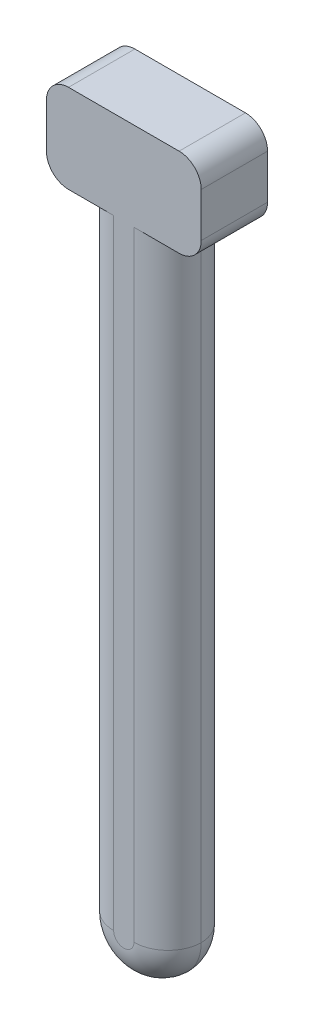
ISO-10303-21;
HEADER;
FILE_DESCRIPTION(('STEP AP214'),'2;1');
FILE_NAME('part.step','',(''),(''),'','','');
FILE_SCHEMA(('AUTOMOTIVE_DESIGN { 1 0 10303 214 1 1 1 1 }'));
ENDSEC;
DATA;
#1=APPLICATION_CONTEXT('core data for automotive mechanical design processes');
#2=APPLICATION_PROTOCOL_DEFINITION('international standard','automotive_design',2000,#1);
#3=PRODUCT_CONTEXT('',#1,'mechanical');
#4=PRODUCT('Part','Part','',(#3));
#5=PRODUCT_RELATED_PRODUCT_CATEGORY('part','',(#4));
#6=PRODUCT_DEFINITION_FORMATION('','',#4);
#7=PRODUCT_DEFINITION_CONTEXT('part definition',#1,'design');
#8=PRODUCT_DEFINITION('design','',#6,#7);
#9=PRODUCT_DEFINITION_SHAPE('','',#8);
#10=(LENGTH_UNIT() NAMED_UNIT(*) SI_UNIT(.MILLI.,.METRE.));
#11=(NAMED_UNIT(*) PLANE_ANGLE_UNIT() SI_UNIT($,.RADIAN.));
#12=(NAMED_UNIT(*) SI_UNIT($,.STERADIAN.) SOLID_ANGLE_UNIT());
#13=UNCERTAINTY_MEASURE_WITH_UNIT(LENGTH_MEASURE(1.E-05),#10,'distance_accuracy_value','');
#14=(GEOMETRIC_REPRESENTATION_CONTEXT(3) GLOBAL_UNCERTAINTY_ASSIGNED_CONTEXT((#13)) GLOBAL_UNIT_ASSIGNED_CONTEXT((#10,
#11,#12)) REPRESENTATION_CONTEXT('',''));
#15=CARTESIAN_POINT('',(0.,0.,0.));
#16=DIRECTION('',(0.,0.,1.));
#17=DIRECTION('',(1.,0.,0.));
#18=AXIS2_PLACEMENT_3D('',#15,#16,#17);
#19=CARTESIAN_POINT('',(0.,2.,3.));
#20=DIRECTION('',(0.,1.,0.));
#21=DIRECTION('',(0.,0.,1.));
#22=AXIS2_PLACEMENT_3D('',#19,#20,#21);
#23=PLANE('',#22);
#24=DIRECTION('',(1.,0.,0.));
#25=VECTOR('',#24,1.);
#26=CARTESIAN_POINT('',(0.,2.,3.));
#27=LINE('',#26,#25);
#28=CARTESIAN_POINT('',(-2.5,2.,3.));
#29=VERTEX_POINT('',#28);
#30=CARTESIAN_POINT('',(2.5,2.,3.));
#31=VERTEX_POINT('',#30);
#32=EDGE_CURVE('E250',#29,#31,#27,.T.);
#33=ORIENTED_EDGE('',*,*,#32,.T.);
#34=DIRECTION('',(0.,0.,-1.));
#35=VECTOR('',#34,1.);
#36=CARTESIAN_POINT('',(2.5,2.,0.));
#37=LINE('',#36,#35);
#38=CARTESIAN_POINT('',(2.5,2.,0.));
#39=VERTEX_POINT('',#38);
#40=EDGE_CURVE('E11',#31,#39,#37,.T.);
#41=ORIENTED_EDGE('',*,*,#40,.T.);
#42=DIRECTION('',(1.,0.,0.));
#43=VECTOR('',#42,1.);
#44=CARTESIAN_POINT('',(0.,2.,0.));
#45=LINE('',#44,#43);
#46=CARTESIAN_POINT('',(-2.5,2.,0.));
#47=VERTEX_POINT('',#46);
#48=EDGE_CURVE('E206',#47,#39,#45,.T.);
#49=ORIENTED_EDGE('',*,*,#48,.F.);
#50=DIRECTION('',(0.,0.,-1.));
#51=VECTOR('',#50,1.);
#52=CARTESIAN_POINT('',(-2.5,2.,3.));
#53=LINE('',#52,#51);
#54=EDGE_CURVE('E43',#47,#29,#53,.F.);
#55=ORIENTED_EDGE('',*,*,#54,.T.);
#56=EDGE_LOOP('',(#33,#41,#49,#55));
#57=FACE_BOUND('',#56,.T.);
#58=ADVANCED_FACE('F35',(#57),#23,.T.);
#59=CARTESIAN_POINT('',(-3.5,0.,3.));
#60=DIRECTION('',(-1.,0.,0.));
#61=DIRECTION('',(0.,0.,1.));
#62=AXIS2_PLACEMENT_3D('',#59,#60,#61);
#63=PLANE('',#62);
#64=DIRECTION('',(0.,1.,0.));
#65=VECTOR('',#64,1.);
#66=CARTESIAN_POINT('',(-3.5,0.,0.));
#67=LINE('',#66,#65);
#68=CARTESIAN_POINT('',(-3.5,-1.,0.));
#69=VERTEX_POINT('',#68);
#70=CARTESIAN_POINT('',(-3.5,1.,0.));
#71=VERTEX_POINT('',#70);
#72=EDGE_CURVE('E259',#69,#71,#67,.T.);
#73=ORIENTED_EDGE('',*,*,#72,.F.);
#74=DIRECTION('',(0.,0.,-1.));
#75=VECTOR('',#74,1.);
#76=CARTESIAN_POINT('',(-3.5,-1.,3.));
#77=LINE('',#76,#75);
#78=CARTESIAN_POINT('',(-3.5,-1.,3.));
#79=VERTEX_POINT('',#78);
#80=EDGE_CURVE('E219',#69,#79,#77,.F.);
#81=ORIENTED_EDGE('',*,*,#80,.T.);
#82=DIRECTION('',(0.,1.,0.));
#83=VECTOR('',#82,1.);
#84=CARTESIAN_POINT('',(-3.5,0.,3.));
#85=LINE('',#84,#83);
#86=CARTESIAN_POINT('',(-3.5,1.,3.));
#87=VERTEX_POINT('',#86);
#88=EDGE_CURVE('E251',#79,#87,#85,.T.);
#89=ORIENTED_EDGE('',*,*,#88,.T.);
#90=DIRECTION('',(0.,0.,-1.));
#91=VECTOR('',#90,1.);
#92=CARTESIAN_POINT('',(-3.5,1.,3.));
#93=LINE('',#92,#91);
#94=EDGE_CURVE('E216',#87,#71,#93,.T.);
#95=ORIENTED_EDGE('',*,*,#94,.T.);
#96=EDGE_LOOP('',(#73,#81,#89,#95));
#97=FACE_BOUND('',#96,.T.);
#98=ADVANCED_FACE('F286',(#97),#63,.T.);
#99=CARTESIAN_POINT('',(0.,-2.,3.));
#100=DIRECTION('',(0.,1.,0.));
#101=DIRECTION('',(0.,0.,1.));
#102=AXIS2_PLACEMENT_3D('',#99,#100,#101);
#103=PLANE('',#102);
#104=DIRECTION('',(1.,0.,0.));
#105=VECTOR('',#104,1.);
#106=CARTESIAN_POINT('',(0.,-2.,3.));
#107=LINE('',#106,#105);
#108=CARTESIAN_POINT('',(-2.5,-2.,3.));
#109=VERTEX_POINT('',#108);
#110=CARTESIAN_POINT('',(-0.460000000000001,-2.,3.));
#111=VERTEX_POINT('',#110);
#112=EDGE_CURVE('E241',#109,#111,#107,.T.);
#113=ORIENTED_EDGE('',*,*,#112,.F.);
#114=DIRECTION('',(0.,0.,-1.));
#115=VECTOR('',#114,1.);
#116=CARTESIAN_POINT('',(-2.5,-2.,0.));
#117=LINE('',#116,#115);
#118=CARTESIAN_POINT('',(-2.5,-2.,0.));
#119=VERTEX_POINT('',#118);
#120=EDGE_CURVE('E187',#109,#119,#117,.T.);
#121=ORIENTED_EDGE('',*,*,#120,.T.);
#122=DIRECTION('',(1.,0.,0.));
#123=VECTOR('',#122,1.);
#124=CARTESIAN_POINT('',(0.,-2.,0.));
#125=LINE('',#124,#123);
#126=CARTESIAN_POINT('',(-0.460000000000001,-2.,0.));
#127=VERTEX_POINT('',#126);
#128=EDGE_CURVE('E148',#119,#127,#125,.T.);
#129=ORIENTED_EDGE('',*,*,#128,.T.);
#130=CARTESIAN_POINT('',(-0.460000000000001,-2.,1.54));
#131=DIRECTION('',(0.,1.,0.));
#132=DIRECTION('',(0.,0.,1.));
#133=AXIS2_PLACEMENT_3D('',#130,#131,#132);
#134=CIRCLE('',#133,1.54);
#135=CARTESIAN_POINT('',(-1.99948043183407,-2.,1.5));
#136=VERTEX_POINT('',#135);
#137=EDGE_CURVE('E182',#127,#136,#134,.T.);
#138=ORIENTED_EDGE('',*,*,#137,.T.);
#139=CARTESIAN_POINT('',(-0.460000000000001,-2.,1.46));
#140=DIRECTION('',(0.,1.,0.));
#141=DIRECTION('',(0.,0.,1.));
#142=AXIS2_PLACEMENT_3D('',#139,#140,#141);
#143=CIRCLE('',#142,1.54);
#144=EDGE_CURVE('E158',#136,#111,#143,.T.);
#145=ORIENTED_EDGE('',*,*,#144,.T.);
#146=EDGE_LOOP('',(#113,#121,#129,#138,#145));
#147=FACE_BOUND('',#146,.T.);
#148=ADVANCED_FACE('F265',(#147),#103,.F.);
#149=CARTESIAN_POINT('',(0.,-2.,3.));
#150=DIRECTION('',(0.,1.,0.));
#151=DIRECTION('',(0.,0.,1.));
#152=AXIS2_PLACEMENT_3D('',#149,#150,#151);
#153=PLANE('',#152);
#154=DIRECTION('',(1.,0.,0.));
#155=VECTOR('',#154,1.);
#156=CARTESIAN_POINT('',(0.,-2.,0.));
#157=LINE('',#156,#155);
#158=CARTESIAN_POINT('',(0.459999999999998,-2.,0.));
#159=VERTEX_POINT('',#158);
#160=CARTESIAN_POINT('',(2.5,-2.,0.));
#161=VERTEX_POINT('',#160);
#162=EDGE_CURVE('E136',#159,#161,#157,.T.);
#163=ORIENTED_EDGE('',*,*,#162,.T.);
#164=DIRECTION('',(0.,0.,-1.));
#165=VECTOR('',#164,1.);
#166=CARTESIAN_POINT('',(2.5,-2.,3.));
#167=LINE('',#166,#165);
#168=CARTESIAN_POINT('',(2.5,-2.,3.));
#169=VERTEX_POINT('',#168);
#170=EDGE_CURVE('E233',#161,#169,#167,.F.);
#171=ORIENTED_EDGE('',*,*,#170,.T.);
#172=DIRECTION('',(1.,0.,0.));
#173=VECTOR('',#172,1.);
#174=CARTESIAN_POINT('',(0.,-2.,3.));
#175=LINE('',#174,#173);
#176=CARTESIAN_POINT('',(0.459999999999998,-2.,3.));
#177=VERTEX_POINT('',#176);
#178=EDGE_CURVE('E169',#177,#169,#175,.T.);
#179=ORIENTED_EDGE('',*,*,#178,.F.);
#180=CARTESIAN_POINT('',(0.459999999999998,-2.,1.46));
#181=DIRECTION('',(0.,1.,0.));
#182=DIRECTION('',(0.,0.,1.));
#183=AXIS2_PLACEMENT_3D('',#180,#181,#182);
#184=CIRCLE('',#183,1.54);
#185=CARTESIAN_POINT('',(1.99948043183406,-2.,1.5));
#186=VERTEX_POINT('',#185);
#187=EDGE_CURVE('E154',#177,#186,#184,.T.);
#188=ORIENTED_EDGE('',*,*,#187,.T.);
#189=CARTESIAN_POINT('',(0.459999999999998,-2.,1.54));
#190=DIRECTION('',(0.,1.,0.));
#191=DIRECTION('',(0.,0.,1.));
#192=AXIS2_PLACEMENT_3D('',#189,#190,#191);
#193=CIRCLE('',#192,1.54);
#194=EDGE_CURVE('E151',#186,#159,#193,.T.);
#195=ORIENTED_EDGE('',*,*,#194,.T.);
#196=EDGE_LOOP('',(#163,#171,#179,#188,#195));
#197=FACE_BOUND('',#196,.T.);
#198=ADVANCED_FACE('F152',(#197),#153,.F.);
#199=CARTESIAN_POINT('',(3.5,0.,3.));
#200=DIRECTION('',(-1.,0.,0.));
#201=DIRECTION('',(0.,0.,1.));
#202=AXIS2_PLACEMENT_3D('',#199,#200,#201);
#203=PLANE('',#202);
#204=DIRECTION('',(0.,1.,0.));
#205=VECTOR('',#204,1.);
#206=CARTESIAN_POINT('',(3.5,0.,3.));
#207=LINE('',#206,#205);
#208=CARTESIAN_POINT('',(3.5,-1.,3.));
#209=VERTEX_POINT('',#208);
#210=CARTESIAN_POINT('',(3.5,1.,3.));
#211=VERTEX_POINT('',#210);
#212=EDGE_CURVE('E165',#209,#211,#207,.T.);
#213=ORIENTED_EDGE('',*,*,#212,.F.);
#214=DIRECTION('',(0.,0.,-1.));
#215=VECTOR('',#214,1.);
#216=CARTESIAN_POINT('',(3.5,-1.,3.));
#217=LINE('',#216,#215);
#218=CARTESIAN_POINT('',(3.5,-1.,0.));
#219=VERTEX_POINT('',#218);
#220=EDGE_CURVE('E230',#209,#219,#217,.T.);
#221=ORIENTED_EDGE('',*,*,#220,.T.);
#222=DIRECTION('',(0.,1.,0.));
#223=VECTOR('',#222,1.);
#224=CARTESIAN_POINT('',(3.5,0.,0.));
#225=LINE('',#224,#223);
#226=CARTESIAN_POINT('',(3.5,1.,0.));
#227=VERTEX_POINT('',#226);
#228=EDGE_CURVE('E147',#219,#227,#225,.T.);
#229=ORIENTED_EDGE('',*,*,#228,.T.);
#230=DIRECTION('',(0.,0.,-1.));
#231=VECTOR('',#230,1.);
#232=CARTESIAN_POINT('',(3.5,1.,3.));
#233=LINE('',#232,#231);
#234=EDGE_CURVE('E228',#227,#211,#233,.F.);
#235=ORIENTED_EDGE('',*,*,#234,.T.);
#236=EDGE_LOOP('',(#213,#221,#229,#235));
#237=FACE_BOUND('',#236,.T.);
#238=ADVANCED_FACE('F247',(#237),#203,.F.);
#239=CARTESIAN_POINT('',(0.,0.,3.));
#240=DIRECTION('',(0.,0.,1.));
#241=DIRECTION('',(1.,0.,0.));
#242=AXIS2_PLACEMENT_3D('',#239,#240,#241);
#243=PLANE('',#242);
#244=ORIENTED_EDGE('',*,*,#88,.F.);
#245=CARTESIAN_POINT('',(-2.5,-1.,3.));
#246=DIRECTION('',(0.,0.,1.));
#247=DIRECTION('',(1.,0.,0.));
#248=AXIS2_PLACEMENT_3D('',#245,#246,#247);
#249=CIRCLE('',#248,1.);
#250=EDGE_CURVE('E226',#79,#109,#249,.T.);
#251=ORIENTED_EDGE('',*,*,#250,.T.);
#252=ORIENTED_EDGE('',*,*,#112,.T.);
#253=DIRECTION('',(0.,-1.,0.));
#254=VECTOR('',#253,1.);
#255=CARTESIAN_POINT('',(-0.459999999999998,-30.,3.));
#256=LINE('',#255,#254);
#257=CARTESIAN_POINT('',(-0.459999999999998,-30.,3.));
#258=VERTEX_POINT('',#257);
#259=EDGE_CURVE('E180',#111,#258,#256,.T.);
#260=ORIENTED_EDGE('',*,*,#259,.T.);
#261=CARTESIAN_POINT('',(0.,-30.,3.));
#262=DIRECTION('',(0.,0.,1.));
#263=DIRECTION('',(1.,0.,0.));
#264=AXIS2_PLACEMENT_3D('',#261,#262,#263);
#265=CIRCLE('',#264,0.46);
#266=CARTESIAN_POINT('',(0.460000000000002,-30.,3.));
#267=VERTEX_POINT('',#266);
#268=EDGE_CURVE('E178',#258,#267,#265,.T.);
#269=ORIENTED_EDGE('',*,*,#268,.T.);
#270=DIRECTION('',(0.,-1.,0.));
#271=VECTOR('',#270,1.);
#272=CARTESIAN_POINT('',(0.459999999999998,0.,3.));
#273=LINE('',#272,#271);
#274=EDGE_CURVE('E175',#267,#177,#273,.F.);
#275=ORIENTED_EDGE('',*,*,#274,.T.);
#276=ORIENTED_EDGE('',*,*,#178,.T.);
#277=CARTESIAN_POINT('',(2.5,-1.,3.));
#278=DIRECTION('',(0.,0.,1.));
#279=DIRECTION('',(1.,0.,0.));
#280=AXIS2_PLACEMENT_3D('',#277,#278,#279);
#281=CIRCLE('',#280,1.);
#282=EDGE_CURVE('E224',#169,#209,#281,.T.);
#283=ORIENTED_EDGE('',*,*,#282,.T.);
#284=ORIENTED_EDGE('',*,*,#212,.T.);
#285=CARTESIAN_POINT('',(2.5,1.,3.));
#286=DIRECTION('',(0.,0.,1.));
#287=DIRECTION('',(1.,0.,0.));
#288=AXIS2_PLACEMENT_3D('',#285,#286,#287);
#289=CIRCLE('',#288,1.);
#290=EDGE_CURVE('E50',#211,#31,#289,.T.);
#291=ORIENTED_EDGE('',*,*,#290,.T.);
#292=ORIENTED_EDGE('',*,*,#32,.F.);
#293=CARTESIAN_POINT('',(-2.5,1.,3.));
#294=DIRECTION('',(0.,0.,1.));
#295=DIRECTION('',(1.,0.,0.));
#296=AXIS2_PLACEMENT_3D('',#293,#294,#295);
#297=CIRCLE('',#296,1.);
#298=EDGE_CURVE('E221',#29,#87,#297,.T.);
#299=ORIENTED_EDGE('',*,*,#298,.T.);
#300=EDGE_LOOP('',(#244,#251,#252,#260,#269,#275,#276,#283,#284,#291,#292,#299));
#301=FACE_BOUND('',#300,.T.);
#302=ADVANCED_FACE('F238',(#301),#243,.T.);
#303=CARTESIAN_POINT('',(0.,0.,0.));
#304=DIRECTION('',(0.,0.,1.));
#305=DIRECTION('',(1.,0.,0.));
#306=AXIS2_PLACEMENT_3D('',#303,#304,#305);
#307=PLANE('',#306);
#308=ORIENTED_EDGE('',*,*,#128,.F.);
#309=CARTESIAN_POINT('',(-2.5,-1.,0.));
#310=DIRECTION('',(0.,0.,1.));
#311=DIRECTION('',(1.,0.,0.));
#312=AXIS2_PLACEMENT_3D('',#309,#310,#311);
#313=CIRCLE('',#312,1.);
#314=EDGE_CURVE('E214',#119,#69,#313,.F.);
#315=ORIENTED_EDGE('',*,*,#314,.T.);
#316=ORIENTED_EDGE('',*,*,#72,.T.);
#317=CARTESIAN_POINT('',(-2.5,1.,0.));
#318=DIRECTION('',(0.,0.,1.));
#319=DIRECTION('',(1.,0.,0.));
#320=AXIS2_PLACEMENT_3D('',#317,#318,#319);
#321=CIRCLE('',#320,1.);
#322=EDGE_CURVE('E209',#71,#47,#321,.F.);
#323=ORIENTED_EDGE('',*,*,#322,.T.);
#324=ORIENTED_EDGE('',*,*,#48,.T.);
#325=CARTESIAN_POINT('',(2.5,1.,0.));
#326=DIRECTION('',(0.,0.,1.));
#327=DIRECTION('',(1.,0.,0.));
#328=AXIS2_PLACEMENT_3D('',#325,#326,#327);
#329=CIRCLE('',#328,1.);
#330=EDGE_CURVE('E211',#39,#227,#329,.F.);
#331=ORIENTED_EDGE('',*,*,#330,.T.);
#332=ORIENTED_EDGE('',*,*,#228,.F.);
#333=CARTESIAN_POINT('',(2.5,-1.,0.));
#334=DIRECTION('',(0.,0.,1.));
#335=DIRECTION('',(1.,0.,0.));
#336=AXIS2_PLACEMENT_3D('',#333,#334,#335);
#337=CIRCLE('',#336,1.);
#338=EDGE_CURVE('E144',#219,#161,#337,.F.);
#339=ORIENTED_EDGE('',*,*,#338,.T.);
#340=ORIENTED_EDGE('',*,*,#162,.F.);
#341=DIRECTION('',(0.,-1.,0.));
#342=VECTOR('',#341,1.);
#343=CARTESIAN_POINT('',(0.460000000000002,-30.,0.));
#344=LINE('',#343,#342);
#345=CARTESIAN_POINT('',(0.460000000000002,-30.,0.));
#346=VERTEX_POINT('',#345);
#347=EDGE_CURVE('E141',#159,#346,#344,.T.);
#348=ORIENTED_EDGE('',*,*,#347,.T.);
#349=CARTESIAN_POINT('',(0.,-30.,0.));
#350=DIRECTION('',(0.,0.,1.));
#351=DIRECTION('',(1.,0.,0.));
#352=AXIS2_PLACEMENT_3D('',#349,#350,#351);
#353=CIRCLE('',#352,0.46);
#354=CARTESIAN_POINT('',(-0.459999999999998,-30.,0.));
#355=VERTEX_POINT('',#354);
#356=EDGE_CURVE('E164',#346,#355,#353,.F.);
#357=ORIENTED_EDGE('',*,*,#356,.T.);
#358=DIRECTION('',(0.,-1.,0.));
#359=VECTOR('',#358,1.);
#360=CARTESIAN_POINT('',(-0.460000000000002,0.,0.));
#361=LINE('',#360,#359);
#362=EDGE_CURVE('E167',#355,#127,#361,.F.);
#363=ORIENTED_EDGE('',*,*,#362,.T.);
#364=EDGE_LOOP('',(#308,#315,#316,#323,#324,#331,#332,#339,#340,#348,#357,#363));
#365=FACE_BOUND('',#364,.T.);
#366=ADVANCED_FACE('F139',(#365),#307,.F.);
#367=CARTESIAN_POINT('',(0.459999999999998,0.,1.46));
#368=DIRECTION('',(0.,-1.,0.));
#369=DIRECTION('',(1.,0.,0.));
#370=AXIS2_PLACEMENT_3D('',#367,#368,#369);
#371=CYLINDRICAL_SURFACE('',#370,1.54);
#372=ORIENTED_EDGE('',*,*,#187,.F.);
#373=ORIENTED_EDGE('',*,*,#274,.F.);
#374=CARTESIAN_POINT('',(0.460000000000002,-30.,1.46));
#375=DIRECTION('',(0.,-1.,0.));
#376=DIRECTION('',(0.,0.,-1.));
#377=AXIS2_PLACEMENT_3D('',#374,#375,#376);
#378=CIRCLE('',#377,1.54);
#379=CARTESIAN_POINT('',(1.99948043183407,-30.,1.5));
#380=VERTEX_POINT('',#379);
#381=EDGE_CURVE('E203',#380,#267,#378,.T.);
#382=ORIENTED_EDGE('',*,*,#381,.F.);
#383=DIRECTION('',(0.,-1.,0.));
#384=VECTOR('',#383,1.);
#385=CARTESIAN_POINT('',(1.99948043183407,-16.,1.5));
#386=LINE('',#385,#384);
#387=EDGE_CURVE('E201',#186,#380,#386,.T.);
#388=ORIENTED_EDGE('',*,*,#387,.F.);
#389=EDGE_LOOP('',(#372,#373,#382,#388));
#390=FACE_BOUND('',#389,.T.);
#391=ADVANCED_FACE('F317',(#390),#371,.T.);
#392=CARTESIAN_POINT('',(0.,-30.,1.46));
#393=DIRECTION('',(0.,0.,1.));
#394=DIRECTION('',(1.,0.,0.));
#395=AXIS2_PLACEMENT_3D('',#392,#393,#394);
#396=DEGENERATE_TOROIDAL_SURFACE('',#395,0.46,1.54,.T.);
#397=ORIENTED_EDGE('',*,*,#381,.T.);
#398=ORIENTED_EDGE('',*,*,#268,.F.);
#399=CARTESIAN_POINT('',(-0.459999999999998,-30.,1.46));
#400=DIRECTION('',(0.,1.,0.));
#401=DIRECTION('',(0.,0.,1.));
#402=AXIS2_PLACEMENT_3D('',#399,#400,#401);
#403=CIRCLE('',#402,1.54);
#404=CARTESIAN_POINT('',(-1.99948043183406,-30.,1.5));
#405=VERTEX_POINT('',#404);
#406=EDGE_CURVE('E198',#405,#258,#403,.T.);
#407=ORIENTED_EDGE('',*,*,#406,.F.);
#408=CARTESIAN_POINT('',(0.,-30.,1.5));
#409=DIRECTION('',(0.,0.,-1.));
#410=DIRECTION('',(-1.,0.,0.));
#411=AXIS2_PLACEMENT_3D('',#408,#409,#410);
#412=CIRCLE('',#411,1.99948043183407);
#413=EDGE_CURVE('E195',#380,#405,#412,.T.);
#414=ORIENTED_EDGE('',*,*,#413,.F.);
#415=EDGE_LOOP('',(#397,#398,#407,#414));
#416=FACE_BOUND('',#415,.T.);
#417=ADVANCED_FACE('F314',(#416),#396,.T.);
#418=CARTESIAN_POINT('',(0.459999999999998,0.,1.54));
#419=DIRECTION('',(0.,1.,0.));
#420=DIRECTION('',(-1.,0.,0.));
#421=AXIS2_PLACEMENT_3D('',#418,#419,#420);
#422=CYLINDRICAL_SURFACE('',#421,1.54);
#423=ORIENTED_EDGE('',*,*,#194,.F.);
#424=ORIENTED_EDGE('',*,*,#387,.T.);
#425=CARTESIAN_POINT('',(0.460000000000002,-30.,1.54));
#426=DIRECTION('',(0.,-1.,0.));
#427=DIRECTION('',(0.,0.,-1.));
#428=AXIS2_PLACEMENT_3D('',#425,#426,#427);
#429=CIRCLE('',#428,1.54);
#430=EDGE_CURVE('E162',#346,#380,#429,.T.);
#431=ORIENTED_EDGE('',*,*,#430,.F.);
#432=ORIENTED_EDGE('',*,*,#347,.F.);
#433=EDGE_LOOP('',(#423,#424,#431,#432));
#434=FACE_BOUND('',#433,.T.);
#435=ADVANCED_FACE('F160',(#434),#422,.T.);
#436=CARTESIAN_POINT('',(-0.460000000000002,0.,1.46));
#437=DIRECTION('',(0.,1.,0.));
#438=DIRECTION('',(-1.,0.,0.));
#439=AXIS2_PLACEMENT_3D('',#436,#437,#438);
#440=CYLINDRICAL_SURFACE('',#439,1.54);
#441=ORIENTED_EDGE('',*,*,#259,.F.);
#442=ORIENTED_EDGE('',*,*,#144,.F.);
#443=DIRECTION('',(0.,1.,0.));
#444=VECTOR('',#443,1.);
#445=CARTESIAN_POINT('',(-1.99948043183406,-16.,1.5));
#446=LINE('',#445,#444);
#447=EDGE_CURVE('E191',#405,#136,#446,.T.);
#448=ORIENTED_EDGE('',*,*,#447,.F.);
#449=ORIENTED_EDGE('',*,*,#406,.T.);
#450=EDGE_LOOP('',(#441,#442,#448,#449));
#451=FACE_BOUND('',#450,.T.);
#452=ADVANCED_FACE('F279',(#451),#440,.T.);
#453=CARTESIAN_POINT('',(0.,-30.,1.54));
#454=DIRECTION('',(0.,0.,1.));
#455=DIRECTION('',(1.,0.,0.));
#456=AXIS2_PLACEMENT_3D('',#453,#454,#455);
#457=DEGENERATE_TOROIDAL_SURFACE('',#456,0.46,1.54,.T.);
#458=ORIENTED_EDGE('',*,*,#430,.T.);
#459=ORIENTED_EDGE('',*,*,#413,.T.);
#460=CARTESIAN_POINT('',(-0.459999999999998,-30.,1.54));
#461=DIRECTION('',(0.,1.,0.));
#462=DIRECTION('',(0.,0.,1.));
#463=AXIS2_PLACEMENT_3D('',#460,#461,#462);
#464=CIRCLE('',#463,1.54);
#465=EDGE_CURVE('E188',#355,#405,#464,.T.);
#466=ORIENTED_EDGE('',*,*,#465,.F.);
#467=ORIENTED_EDGE('',*,*,#356,.F.);
#468=EDGE_LOOP('',(#458,#459,#466,#467));
#469=FACE_BOUND('',#468,.T.);
#470=ADVANCED_FACE('F274',(#469),#457,.T.);
#471=CARTESIAN_POINT('',(-0.460000000000002,0.,1.54));
#472=DIRECTION('',(0.,-1.,0.));
#473=DIRECTION('',(1.,0.,0.));
#474=AXIS2_PLACEMENT_3D('',#471,#472,#473);
#475=CYLINDRICAL_SURFACE('',#474,1.54);
#476=ORIENTED_EDGE('',*,*,#137,.F.);
#477=ORIENTED_EDGE('',*,*,#362,.F.);
#478=ORIENTED_EDGE('',*,*,#465,.T.);
#479=ORIENTED_EDGE('',*,*,#447,.T.);
#480=EDGE_LOOP('',(#476,#477,#478,#479));
#481=FACE_BOUND('',#480,.T.);
#482=ADVANCED_FACE('F270',(#481),#475,.T.);
#483=CARTESIAN_POINT('',(-2.5,-1.,3.));
#484=DIRECTION('',(0.,0.,1.));
#485=DIRECTION('',(1.,0.,0.));
#486=AXIS2_PLACEMENT_3D('',#483,#484,#485);
#487=CYLINDRICAL_SURFACE('',#486,1.);
#488=ORIENTED_EDGE('',*,*,#250,.F.);
#489=ORIENTED_EDGE('',*,*,#80,.F.);
#490=ORIENTED_EDGE('',*,*,#314,.F.);
#491=ORIENTED_EDGE('',*,*,#120,.F.);
#492=EDGE_LOOP('',(#488,#489,#490,#491));
#493=FACE_BOUND('',#492,.T.);
#494=ADVANCED_FACE('F282',(#493),#487,.T.);
#495=CARTESIAN_POINT('',(2.5,-1.,3.));
#496=DIRECTION('',(0.,0.,-1.));
#497=DIRECTION('',(-1.,0.,0.));
#498=AXIS2_PLACEMENT_3D('',#495,#496,#497);
#499=CYLINDRICAL_SURFACE('',#498,1.);
#500=ORIENTED_EDGE('',*,*,#282,.F.);
#501=ORIENTED_EDGE('',*,*,#170,.F.);
#502=ORIENTED_EDGE('',*,*,#338,.F.);
#503=ORIENTED_EDGE('',*,*,#220,.F.);
#504=EDGE_LOOP('',(#500,#501,#502,#503));
#505=FACE_BOUND('',#504,.T.);
#506=ADVANCED_FACE('F244',(#505),#499,.T.);
#507=CARTESIAN_POINT('',(2.5,1.,3.));
#508=DIRECTION('',(0.,0.,1.));
#509=DIRECTION('',(1.,0.,0.));
#510=AXIS2_PLACEMENT_3D('',#507,#508,#509);
#511=CYLINDRICAL_SURFACE('',#510,1.);
#512=ORIENTED_EDGE('',*,*,#290,.F.);
#513=ORIENTED_EDGE('',*,*,#234,.F.);
#514=ORIENTED_EDGE('',*,*,#330,.F.);
#515=ORIENTED_EDGE('',*,*,#40,.F.);
#516=EDGE_LOOP('',(#512,#513,#514,#515));
#517=FACE_BOUND('',#516,.T.);
#518=ADVANCED_FACE('F291',(#517),#511,.T.);
#519=CARTESIAN_POINT('',(-2.5,1.,3.));
#520=DIRECTION('',(0.,0.,-1.));
#521=DIRECTION('',(-1.,0.,0.));
#522=AXIS2_PLACEMENT_3D('',#519,#520,#521);
#523=CYLINDRICAL_SURFACE('',#522,1.);
#524=ORIENTED_EDGE('',*,*,#298,.F.);
#525=ORIENTED_EDGE('',*,*,#54,.F.);
#526=ORIENTED_EDGE('',*,*,#322,.F.);
#527=ORIENTED_EDGE('',*,*,#94,.F.);
#528=EDGE_LOOP('',(#524,#525,#526,#527));
#529=FACE_BOUND('',#528,.T.);
#530=ADVANCED_FACE('F37',(#529),#523,.T.);
#531=CLOSED_SHELL('',(#58,#98,#148,#198,#238,#302,#366,#391,#417,#435,#452,#470,#482,#494,#506,
#518,#530));
#532=MANIFOLD_SOLID_BREP('B2',#531);
#533=ADVANCED_BREP_SHAPE_REPRESENTATION('',(#18,#532),#14);
#534=SHAPE_DEFINITION_REPRESENTATION(#9,#533);
ENDSEC;
END-ISO-10303-21;
